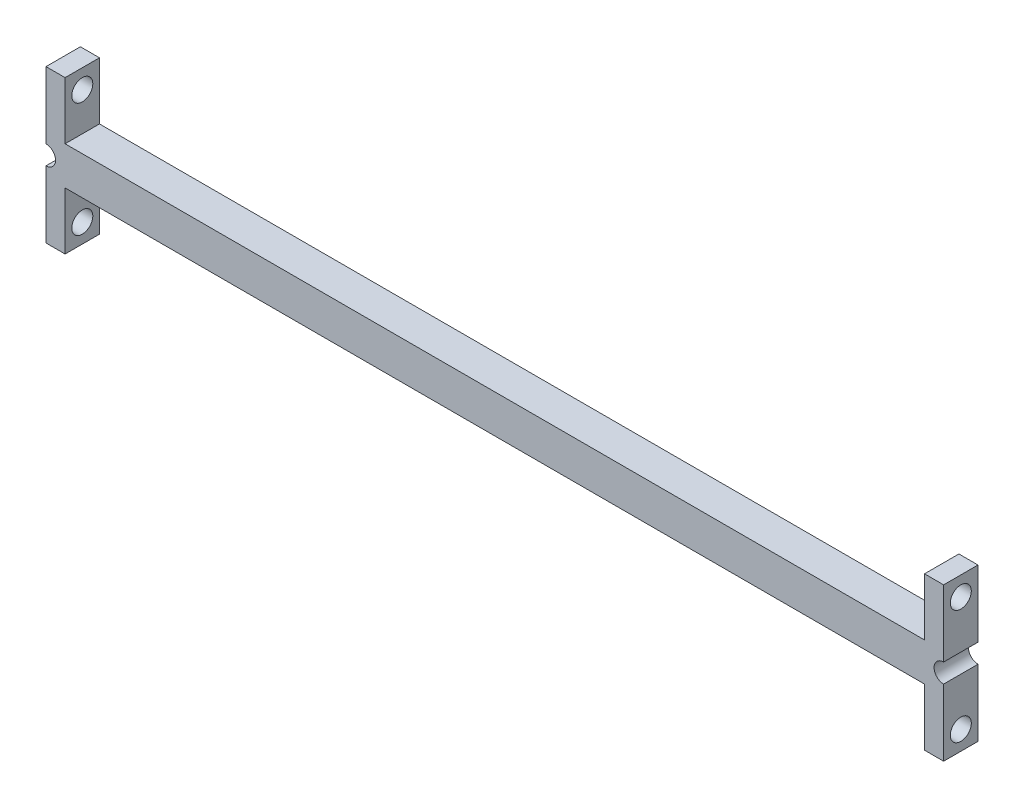
ISO-10303-21;
HEADER;
FILE_DESCRIPTION(('STEP AP214'),'2;1');
FILE_NAME('part.step','',(''),(''),'','','');
FILE_SCHEMA(('AUTOMOTIVE_DESIGN { 1 0 10303 214 1 1 1 1 }'));
ENDSEC;
DATA;
#1=APPLICATION_CONTEXT('core data for automotive mechanical design processes');
#2=APPLICATION_PROTOCOL_DEFINITION('international standard','automotive_design',2000,#1);
#3=PRODUCT_CONTEXT('',#1,'mechanical');
#4=PRODUCT('Part','Part','',(#3));
#5=PRODUCT_RELATED_PRODUCT_CATEGORY('part','',(#4));
#6=PRODUCT_DEFINITION_FORMATION('','',#4);
#7=PRODUCT_DEFINITION_CONTEXT('part definition',#1,'design');
#8=PRODUCT_DEFINITION('design','',#6,#7);
#9=PRODUCT_DEFINITION_SHAPE('','',#8);
#10=(LENGTH_UNIT() NAMED_UNIT(*) SI_UNIT(.MILLI.,.METRE.));
#11=(NAMED_UNIT(*) PLANE_ANGLE_UNIT() SI_UNIT($,.RADIAN.));
#12=(NAMED_UNIT(*) SI_UNIT($,.STERADIAN.) SOLID_ANGLE_UNIT());
#13=UNCERTAINTY_MEASURE_WITH_UNIT(LENGTH_MEASURE(1.E-05),#10,'distance_accuracy_value','');
#14=(GEOMETRIC_REPRESENTATION_CONTEXT(3) GLOBAL_UNCERTAINTY_ASSIGNED_CONTEXT((#13)) GLOBAL_UNIT_ASSIGNED_CONTEXT((#10,
#11,#12)) REPRESENTATION_CONTEXT('',''));
#15=CARTESIAN_POINT('',(0.,0.,0.));
#16=DIRECTION('',(0.,0.,1.));
#17=DIRECTION('',(1.,0.,0.));
#18=AXIS2_PLACEMENT_3D('',#15,#16,#17);
#19=CARTESIAN_POINT('',(0.,0.,9.));
#20=DIRECTION('',(1.,0.,0.));
#21=DIRECTION('',(0.,1.,0.));
#22=AXIS2_PLACEMENT_3D('',#19,#20,#21);
#23=PLANE('',#22);
#24=CARTESIAN_POINT('',(0.,10.,4.5));
#25=DIRECTION('',(-1.,0.,0.));
#26=DIRECTION('',(0.,-1.,0.));
#27=AXIS2_PLACEMENT_3D('',#24,#25,#26);
#28=CIRCLE('',#27,2.75);
#29=CARTESIAN_POINT('',(0.,7.25,4.5));
#30=VERTEX_POINT('',#29);
#31=EDGE_CURVE('E205',#30,#30,#28,.T.);
#32=ORIENTED_EDGE('',*,*,#31,.F.);
#33=EDGE_LOOP('',(#32));
#34=FACE_BOUND('',#33,.T.);
#35=DIRECTION('',(0.,-1.,0.));
#36=VECTOR('',#35,1.);
#37=CARTESIAN_POINT('',(0.,0.,0.));
#38=LINE('',#37,#36);
#39=CARTESIAN_POINT('',(0.,15.,0.));
#40=VERTEX_POINT('',#39);
#41=CARTESIAN_POINT('',(0.,-2.5,0.));
#42=VERTEX_POINT('',#41);
#43=EDGE_CURVE('E162',#40,#42,#38,.T.);
#44=ORIENTED_EDGE('',*,*,#43,.T.);
#45=DIRECTION('',(0.,0.,1.));
#46=VECTOR('',#45,1.);
#47=CARTESIAN_POINT('',(0.,-2.5,-23.));
#48=LINE('',#47,#46);
#49=CARTESIAN_POINT('',(0.,-2.5,9.));
#50=VERTEX_POINT('',#49);
#51=EDGE_CURVE('E59',#42,#50,#48,.T.);
#52=ORIENTED_EDGE('',*,*,#51,.T.);
#53=DIRECTION('',(0.,-1.,0.));
#54=VECTOR('',#53,1.);
#55=CARTESIAN_POINT('',(0.,0.,9.));
#56=LINE('',#55,#54);
#57=CARTESIAN_POINT('',(0.,15.,9.));
#58=VERTEX_POINT('',#57);
#59=EDGE_CURVE('E160',#58,#50,#56,.T.);
#60=ORIENTED_EDGE('',*,*,#59,.F.);
#61=DIRECTION('',(0.,0.,1.));
#62=VECTOR('',#61,1.);
#63=CARTESIAN_POINT('',(0.,15.,0.));
#64=LINE('',#63,#62);
#65=EDGE_CURVE('E242',#40,#58,#64,.T.);
#66=ORIENTED_EDGE('',*,*,#65,.F.);
#67=EDGE_LOOP('',(#44,#52,#60,#66));
#68=FACE_BOUND('',#67,.T.);
#69=ADVANCED_FACE('F35',(#34,#68),#23,.F.);
#70=CARTESIAN_POINT('',(235.,0.,9.));
#71=DIRECTION('',(-1.,0.,0.));
#72=DIRECTION('',(0.,0.,1.));
#73=AXIS2_PLACEMENT_3D('',#70,#71,#72);
#74=PLANE('',#73);
#75=CARTESIAN_POINT('',(235.,-20.,4.5));
#76=DIRECTION('',(-1.,0.,0.));
#77=DIRECTION('',(0.,-1.,0.));
#78=AXIS2_PLACEMENT_3D('',#75,#76,#77);
#79=CIRCLE('',#78,2.75);
#80=CARTESIAN_POINT('',(235.,-22.75,4.5));
#81=VERTEX_POINT('',#80);
#82=EDGE_CURVE('E215',#81,#81,#79,.T.);
#83=ORIENTED_EDGE('',*,*,#82,.T.);
#84=EDGE_LOOP('',(#83));
#85=FACE_BOUND('',#84,.T.);
#86=DIRECTION('',(0.,1.,0.));
#87=VECTOR('',#86,1.);
#88=CARTESIAN_POINT('',(235.,0.,0.));
#89=LINE('',#88,#87);
#90=CARTESIAN_POINT('',(235.,-25.,0.));
#91=VERTEX_POINT('',#90);
#92=CARTESIAN_POINT('',(235.,-7.49999999999999,0.));
#93=VERTEX_POINT('',#92);
#94=EDGE_CURVE('E191',#91,#93,#89,.T.);
#95=ORIENTED_EDGE('',*,*,#94,.T.);
#96=DIRECTION('',(0.,0.,1.));
#97=VECTOR('',#96,1.);
#98=CARTESIAN_POINT('',(235.,-7.49999999999999,-23.));
#99=LINE('',#98,#97);
#100=CARTESIAN_POINT('',(235.,-7.49999999999999,9.));
#101=VERTEX_POINT('',#100);
#102=EDGE_CURVE('E52',#93,#101,#99,.T.);
#103=ORIENTED_EDGE('',*,*,#102,.T.);
#104=DIRECTION('',(0.,1.,0.));
#105=VECTOR('',#104,1.);
#106=CARTESIAN_POINT('',(235.,0.,9.));
#107=LINE('',#106,#105);
#108=CARTESIAN_POINT('',(235.,-25.,9.));
#109=VERTEX_POINT('',#108);
#110=EDGE_CURVE('E180',#109,#101,#107,.T.);
#111=ORIENTED_EDGE('',*,*,#110,.F.);
#112=DIRECTION('',(0.,0.,1.));
#113=VECTOR('',#112,1.);
#114=CARTESIAN_POINT('',(235.,-25.,0.));
#115=LINE('',#114,#113);
#116=EDGE_CURVE('E282',#91,#109,#115,.T.);
#117=ORIENTED_EDGE('',*,*,#116,.F.);
#118=EDGE_LOOP('',(#95,#103,#111,#117));
#119=FACE_BOUND('',#118,.T.);
#120=ADVANCED_FACE('F324',(#85,#119),#74,.F.);
#121=CARTESIAN_POINT('',(0.,-20.,4.5));
#122=DIRECTION('',(-1.,0.,0.));
#123=DIRECTION('',(0.,-1.,0.));
#124=AXIS2_PLACEMENT_3D('',#121,#122,#123);
#125=CIRCLE('',#124,2.75);
#126=CARTESIAN_POINT('',(0.,-22.75,4.5));
#127=VERTEX_POINT('',#126);
#128=EDGE_CURVE('E210',#127,#127,#125,.T.);
#129=ORIENTED_EDGE('',*,*,#128,.F.);
#130=EDGE_LOOP('',(#129));
#131=FACE_BOUND('',#130,.T.);
#132=CARTESIAN_POINT('',(0.,-7.5,9.));
#133=VERTEX_POINT('',#132);
#134=CARTESIAN_POINT('',(0.,-25.,9.));
#135=VERTEX_POINT('',#134);
#136=EDGE_CURVE('E171',#133,#135,#56,.T.);
#137=ORIENTED_EDGE('',*,*,#136,.F.);
#138=DIRECTION('',(0.,0.,1.));
#139=VECTOR('',#138,1.);
#140=CARTESIAN_POINT('',(0.,-7.5,-23.));
#141=LINE('',#140,#139);
#142=CARTESIAN_POINT('',(0.,-7.5,0.));
#143=VERTEX_POINT('',#142);
#144=EDGE_CURVE('E150',#133,#143,#141,.F.);
#145=ORIENTED_EDGE('',*,*,#144,.T.);
#146=CARTESIAN_POINT('',(0.,-25.,0.));
#147=VERTEX_POINT('',#146);
#148=EDGE_CURVE('E188',#143,#147,#38,.T.);
#149=ORIENTED_EDGE('',*,*,#148,.T.);
#150=DIRECTION('',(0.,0.,1.));
#151=VECTOR('',#150,1.);
#152=CARTESIAN_POINT('',(0.,-25.,0.));
#153=LINE('',#152,#151);
#154=EDGE_CURVE('E235',#147,#135,#153,.T.);
#155=ORIENTED_EDGE('',*,*,#154,.T.);
#156=EDGE_LOOP('',(#137,#145,#149,#155));
#157=FACE_BOUND('',#156,.T.);
#158=ADVANCED_FACE('F37',(#131,#157),#23,.F.);
#159=CARTESIAN_POINT('',(0.,-10.,9.));
#160=DIRECTION('',(0.,1.,0.));
#161=DIRECTION('',(-1.,0.,0.));
#162=AXIS2_PLACEMENT_3D('',#159,#160,#161);
#163=PLANE('',#162);
#164=DIRECTION('',(1.,0.,0.));
#165=VECTOR('',#164,1.);
#166=CARTESIAN_POINT('',(0.,-10.,9.));
#167=LINE('',#166,#165);
#168=CARTESIAN_POINT('',(5.,-10.,9.));
#169=VERTEX_POINT('',#168);
#170=CARTESIAN_POINT('',(230.,-10.,9.));
#171=VERTEX_POINT('',#170);
#172=EDGE_CURVE('E170',#169,#171,#167,.T.);
#173=ORIENTED_EDGE('',*,*,#172,.F.);
#174=DIRECTION('',(0.,0.,-1.));
#175=VECTOR('',#174,1.);
#176=CARTESIAN_POINT('',(5.,-10.,9.));
#177=LINE('',#176,#175);
#178=CARTESIAN_POINT('',(5.,-10.,0.));
#179=VERTEX_POINT('',#178);
#180=EDGE_CURVE('E254',#169,#179,#177,.T.);
#181=ORIENTED_EDGE('',*,*,#180,.T.);
#182=DIRECTION('',(1.,0.,0.));
#183=VECTOR('',#182,1.);
#184=CARTESIAN_POINT('',(0.,-10.,0.));
#185=LINE('',#184,#183);
#186=CARTESIAN_POINT('',(230.,-10.,0.));
#187=VERTEX_POINT('',#186);
#188=EDGE_CURVE('E187',#179,#187,#185,.T.);
#189=ORIENTED_EDGE('',*,*,#188,.T.);
#190=DIRECTION('',(0.,0.,1.));
#191=VECTOR('',#190,1.);
#192=CARTESIAN_POINT('',(230.,-10.,9.));
#193=LINE('',#192,#191);
#194=EDGE_CURVE('E177',#187,#171,#193,.T.);
#195=ORIENTED_EDGE('',*,*,#194,.T.);
#196=EDGE_LOOP('',(#173,#181,#189,#195));
#197=FACE_BOUND('',#196,.T.);
#198=ADVANCED_FACE('F312',(#197),#163,.F.);
#199=CARTESIAN_POINT('',(235.,10.,4.5));
#200=DIRECTION('',(-1.,0.,0.));
#201=DIRECTION('',(0.,-1.,0.));
#202=AXIS2_PLACEMENT_3D('',#199,#200,#201);
#203=CIRCLE('',#202,2.75);
#204=CARTESIAN_POINT('',(235.,7.25000000000003,4.5));
#205=VERTEX_POINT('',#204);
#206=EDGE_CURVE('E199',#205,#205,#203,.T.);
#207=ORIENTED_EDGE('',*,*,#206,.T.);
#208=EDGE_LOOP('',(#207));
#209=FACE_BOUND('',#208,.T.);
#210=CARTESIAN_POINT('',(235.,-2.5,9.));
#211=VERTEX_POINT('',#210);
#212=CARTESIAN_POINT('',(235.,15.,9.));
#213=VERTEX_POINT('',#212);
#214=EDGE_CURVE('E173',#211,#213,#107,.T.);
#215=ORIENTED_EDGE('',*,*,#214,.F.);
#216=DIRECTION('',(0.,0.,1.));
#217=VECTOR('',#216,1.);
#218=CARTESIAN_POINT('',(235.,-2.5,-23.));
#219=LINE('',#218,#217);
#220=CARTESIAN_POINT('',(235.,-2.5,0.));
#221=VERTEX_POINT('',#220);
#222=EDGE_CURVE('E163',#211,#221,#219,.F.);
#223=ORIENTED_EDGE('',*,*,#222,.T.);
#224=CARTESIAN_POINT('',(235.,15.,0.));
#225=VERTEX_POINT('',#224);
#226=EDGE_CURVE('E190',#221,#225,#89,.T.);
#227=ORIENTED_EDGE('',*,*,#226,.T.);
#228=DIRECTION('',(0.,0.,1.));
#229=VECTOR('',#228,1.);
#230=CARTESIAN_POINT('',(235.,15.,0.));
#231=LINE('',#230,#229);
#232=EDGE_CURVE('E279',#225,#213,#231,.T.);
#233=ORIENTED_EDGE('',*,*,#232,.T.);
#234=EDGE_LOOP('',(#215,#223,#227,#233));
#235=FACE_BOUND('',#234,.T.);
#236=ADVANCED_FACE('F328',(#209,#235),#74,.F.);
#237=CARTESIAN_POINT('',(0.,0.,9.));
#238=DIRECTION('',(0.,-1.,0.));
#239=DIRECTION('',(0.,0.,-1.));
#240=AXIS2_PLACEMENT_3D('',#237,#238,#239);
#241=PLANE('',#240);
#242=DIRECTION('',(-1.,0.,0.));
#243=VECTOR('',#242,1.);
#244=CARTESIAN_POINT('',(0.,0.,0.));
#245=LINE('',#244,#243);
#246=CARTESIAN_POINT('',(230.,0.,0.));
#247=VERTEX_POINT('',#246);
#248=CARTESIAN_POINT('',(5.,0.,0.));
#249=VERTEX_POINT('',#248);
#250=EDGE_CURVE('E175',#247,#249,#245,.T.);
#251=ORIENTED_EDGE('',*,*,#250,.T.);
#252=DIRECTION('',(0.,0.,1.));
#253=VECTOR('',#252,1.);
#254=CARTESIAN_POINT('',(5.,0.,9.));
#255=LINE('',#254,#253);
#256=CARTESIAN_POINT('',(5.,0.,9.));
#257=VERTEX_POINT('',#256);
#258=EDGE_CURVE('E244',#249,#257,#255,.T.);
#259=ORIENTED_EDGE('',*,*,#258,.T.);
#260=DIRECTION('',(-1.,0.,0.));
#261=VECTOR('',#260,1.);
#262=CARTESIAN_POINT('',(0.,0.,9.));
#263=LINE('',#262,#261);
#264=CARTESIAN_POINT('',(230.,0.,9.));
#265=VERTEX_POINT('',#264);
#266=EDGE_CURVE('E183',#265,#257,#263,.T.);
#267=ORIENTED_EDGE('',*,*,#266,.F.);
#268=DIRECTION('',(0.,0.,-1.));
#269=VECTOR('',#268,1.);
#270=CARTESIAN_POINT('',(230.,0.,9.));
#271=LINE('',#270,#269);
#272=EDGE_CURVE('E278',#265,#247,#271,.T.);
#273=ORIENTED_EDGE('',*,*,#272,.T.);
#274=EDGE_LOOP('',(#251,#259,#267,#273));
#275=FACE_BOUND('',#274,.T.);
#276=ADVANCED_FACE('F337',(#275),#241,.F.);
#277=CARTESIAN_POINT('',(0.,0.,9.));
#278=DIRECTION('',(0.,0.,1.));
#279=DIRECTION('',(1.,0.,0.));
#280=AXIS2_PLACEMENT_3D('',#277,#278,#279);
#281=PLANE('',#280);
#282=CARTESIAN_POINT('',(235.,-5.,9.));
#283=DIRECTION('',(0.,0.,1.));
#284=DIRECTION('',(1.,0.,0.));
#285=AXIS2_PLACEMENT_3D('',#282,#283,#284);
#286=CIRCLE('',#285,2.5);
#287=EDGE_CURVE('E154',#211,#101,#286,.T.);
#288=ORIENTED_EDGE('',*,*,#287,.F.);
#289=ORIENTED_EDGE('',*,*,#214,.T.);
#290=DIRECTION('',(-1.,0.,0.));
#291=VECTOR('',#290,1.);
#292=CARTESIAN_POINT('',(230.,15.,9.));
#293=LINE('',#292,#291);
#294=CARTESIAN_POINT('',(230.,15.,9.));
#295=VERTEX_POINT('',#294);
#296=EDGE_CURVE('E273',#213,#295,#293,.T.);
#297=ORIENTED_EDGE('',*,*,#296,.T.);
#298=DIRECTION('',(0.,-1.,0.));
#299=VECTOR('',#298,1.);
#300=CARTESIAN_POINT('',(230.,15.,9.));
#301=LINE('',#300,#299);
#302=EDGE_CURVE('E268',#295,#265,#301,.T.);
#303=ORIENTED_EDGE('',*,*,#302,.T.);
#304=ORIENTED_EDGE('',*,*,#266,.T.);
#305=DIRECTION('',(0.,1.,0.));
#306=VECTOR('',#305,1.);
#307=CARTESIAN_POINT('',(5.,15.,9.));
#308=LINE('',#307,#306);
#309=CARTESIAN_POINT('',(5.,15.,9.));
#310=VERTEX_POINT('',#309);
#311=EDGE_CURVE('E238',#257,#310,#308,.T.);
#312=ORIENTED_EDGE('',*,*,#311,.T.);
#313=DIRECTION('',(-1.,0.,0.));
#314=VECTOR('',#313,1.);
#315=CARTESIAN_POINT('',(0.,15.,9.));
#316=LINE('',#315,#314);
#317=EDGE_CURVE('E169',#310,#58,#316,.T.);
#318=ORIENTED_EDGE('',*,*,#317,.T.);
#319=ORIENTED_EDGE('',*,*,#59,.T.);
#320=CARTESIAN_POINT('',(0.,-5.,9.));
#321=DIRECTION('',(0.,0.,1.));
#322=DIRECTION('',(1.,0.,0.));
#323=AXIS2_PLACEMENT_3D('',#320,#321,#322);
#324=CIRCLE('',#323,2.5);
#325=EDGE_CURVE('E147',#133,#50,#324,.T.);
#326=ORIENTED_EDGE('',*,*,#325,.F.);
#327=ORIENTED_EDGE('',*,*,#136,.T.);
#328=DIRECTION('',(1.,0.,0.));
#329=VECTOR('',#328,1.);
#330=CARTESIAN_POINT('',(0.,-25.,9.));
#331=LINE('',#330,#329);
#332=CARTESIAN_POINT('',(5.00000000000001,-25.,9.));
#333=VERTEX_POINT('',#332);
#334=EDGE_CURVE('E225',#135,#333,#331,.T.);
#335=ORIENTED_EDGE('',*,*,#334,.T.);
#336=EDGE_CURVE('E239',#333,#169,#308,.T.);
#337=ORIENTED_EDGE('',*,*,#336,.T.);
#338=ORIENTED_EDGE('',*,*,#172,.T.);
#339=CARTESIAN_POINT('',(230.,-25.,9.));
#340=VERTEX_POINT('',#339);
#341=EDGE_CURVE('E257',#171,#340,#301,.T.);
#342=ORIENTED_EDGE('',*,*,#341,.T.);
#343=DIRECTION('',(1.,0.,0.));
#344=VECTOR('',#343,1.);
#345=CARTESIAN_POINT('',(230.,-25.,9.));
#346=LINE('',#345,#344);
#347=EDGE_CURVE('E270',#340,#109,#346,.T.);
#348=ORIENTED_EDGE('',*,*,#347,.T.);
#349=ORIENTED_EDGE('',*,*,#110,.T.);
#350=EDGE_LOOP('',(#288,#289,#297,#303,#304,#312,#318,#319,#326,#327,#335,#337,#338,#342,#348,#349));
#351=FACE_BOUND('',#350,.T.);
#352=ADVANCED_FACE('F167',(#351),#281,.T.);
#353=CARTESIAN_POINT('',(0.,0.,0.));
#354=DIRECTION('',(0.,0.,1.));
#355=DIRECTION('',(1.,0.,0.));
#356=AXIS2_PLACEMENT_3D('',#353,#354,#355);
#357=PLANE('',#356);
#358=ORIENTED_EDGE('',*,*,#226,.F.);
#359=CARTESIAN_POINT('',(235.,-5.,0.));
#360=DIRECTION('',(0.,0.,1.));
#361=DIRECTION('',(1.,0.,0.));
#362=AXIS2_PLACEMENT_3D('',#359,#360,#361);
#363=CIRCLE('',#362,2.5);
#364=EDGE_CURVE('E11',#221,#93,#363,.T.);
#365=ORIENTED_EDGE('',*,*,#364,.T.);
#366=ORIENTED_EDGE('',*,*,#94,.F.);
#367=DIRECTION('',(1.,0.,0.));
#368=VECTOR('',#367,1.);
#369=CARTESIAN_POINT('',(230.,-25.,0.));
#370=LINE('',#369,#368);
#371=CARTESIAN_POINT('',(230.,-25.,0.));
#372=VERTEX_POINT('',#371);
#373=EDGE_CURVE('E260',#372,#91,#370,.T.);
#374=ORIENTED_EDGE('',*,*,#373,.F.);
#375=DIRECTION('',(0.,-1.,0.));
#376=VECTOR('',#375,1.);
#377=CARTESIAN_POINT('',(230.,15.,0.));
#378=LINE('',#377,#376);
#379=EDGE_CURVE('E261',#187,#372,#378,.T.);
#380=ORIENTED_EDGE('',*,*,#379,.F.);
#381=ORIENTED_EDGE('',*,*,#188,.F.);
#382=DIRECTION('',(0.,1.,0.));
#383=VECTOR('',#382,1.);
#384=CARTESIAN_POINT('',(5.,15.,0.));
#385=LINE('',#384,#383);
#386=CARTESIAN_POINT('',(5.00000000000001,-25.,0.));
#387=VERTEX_POINT('',#386);
#388=EDGE_CURVE('E230',#387,#179,#385,.T.);
#389=ORIENTED_EDGE('',*,*,#388,.F.);
#390=DIRECTION('',(1.,0.,0.));
#391=VECTOR('',#390,1.);
#392=CARTESIAN_POINT('',(0.,-25.,0.));
#393=LINE('',#392,#391);
#394=EDGE_CURVE('E226',#147,#387,#393,.T.);
#395=ORIENTED_EDGE('',*,*,#394,.F.);
#396=ORIENTED_EDGE('',*,*,#148,.F.);
#397=CARTESIAN_POINT('',(0.,-5.,0.));
#398=DIRECTION('',(0.,0.,1.));
#399=DIRECTION('',(1.,0.,0.));
#400=AXIS2_PLACEMENT_3D('',#397,#398,#399);
#401=CIRCLE('',#400,2.5);
#402=EDGE_CURVE('E44',#143,#42,#401,.T.);
#403=ORIENTED_EDGE('',*,*,#402,.T.);
#404=ORIENTED_EDGE('',*,*,#43,.F.);
#405=DIRECTION('',(-1.,0.,0.));
#406=VECTOR('',#405,1.);
#407=CARTESIAN_POINT('',(0.,15.,0.));
#408=LINE('',#407,#406);
#409=CARTESIAN_POINT('',(5.,15.,0.));
#410=VERTEX_POINT('',#409);
#411=EDGE_CURVE('E232',#410,#40,#408,.T.);
#412=ORIENTED_EDGE('',*,*,#411,.F.);
#413=EDGE_CURVE('E229',#249,#410,#385,.T.);
#414=ORIENTED_EDGE('',*,*,#413,.F.);
#415=ORIENTED_EDGE('',*,*,#250,.F.);
#416=CARTESIAN_POINT('',(230.,15.,0.));
#417=VERTEX_POINT('',#416);
#418=EDGE_CURVE('E258',#417,#247,#378,.T.);
#419=ORIENTED_EDGE('',*,*,#418,.F.);
#420=DIRECTION('',(-1.,0.,0.));
#421=VECTOR('',#420,1.);
#422=CARTESIAN_POINT('',(230.,15.,0.));
#423=LINE('',#422,#421);
#424=EDGE_CURVE('E264',#225,#417,#423,.T.);
#425=ORIENTED_EDGE('',*,*,#424,.F.);
#426=EDGE_LOOP('',(#358,#365,#366,#374,#380,#381,#389,#395,#396,#403,#404,#412,#414,#415,#419,#425));
#427=FACE_BOUND('',#426,.T.);
#428=ADVANCED_FACE('F305',(#427),#357,.F.);
#429=CARTESIAN_POINT('',(230.,15.,0.));
#430=DIRECTION('',(0.,1.,0.));
#431=DIRECTION('',(0.,0.,1.));
#432=AXIS2_PLACEMENT_3D('',#429,#430,#431);
#433=PLANE('',#432);
#434=ORIENTED_EDGE('',*,*,#296,.F.);
#435=ORIENTED_EDGE('',*,*,#232,.F.);
#436=ORIENTED_EDGE('',*,*,#424,.T.);
#437=DIRECTION('',(0.,0.,1.));
#438=VECTOR('',#437,1.);
#439=CARTESIAN_POINT('',(230.,15.,0.));
#440=LINE('',#439,#438);
#441=EDGE_CURVE('E276',#417,#295,#440,.T.);
#442=ORIENTED_EDGE('',*,*,#441,.T.);
#443=EDGE_LOOP('',(#434,#435,#436,#442));
#444=FACE_BOUND('',#443,.T.);
#445=ADVANCED_FACE('F333',(#444),#433,.T.);
#446=CARTESIAN_POINT('',(230.,15.,0.));
#447=DIRECTION('',(-1.,0.,0.));
#448=DIRECTION('',(0.,0.,1.));
#449=AXIS2_PLACEMENT_3D('',#446,#447,#448);
#450=PLANE('',#449);
#451=CARTESIAN_POINT('',(230.,10.,4.5));
#452=DIRECTION('',(-1.,0.,0.));
#453=DIRECTION('',(0.,0.,1.));
#454=AXIS2_PLACEMENT_3D('',#451,#452,#453);
#455=CIRCLE('',#454,2.75);
#456=CARTESIAN_POINT('',(230.,7.25000000000003,4.5));
#457=VERTEX_POINT('',#456);
#458=EDGE_CURVE('E155',#457,#457,#455,.T.);
#459=ORIENTED_EDGE('',*,*,#458,.F.);
#460=EDGE_LOOP('',(#459));
#461=FACE_BOUND('',#460,.T.);
#462=ORIENTED_EDGE('',*,*,#272,.F.);
#463=ORIENTED_EDGE('',*,*,#302,.F.);
#464=ORIENTED_EDGE('',*,*,#441,.F.);
#465=ORIENTED_EDGE('',*,*,#418,.T.);
#466=EDGE_LOOP('',(#462,#463,#464,#465));
#467=FACE_BOUND('',#466,.T.);
#468=ADVANCED_FACE('F336',(#461,#467),#450,.T.);
#469=CARTESIAN_POINT('',(230.,-20.,4.5));
#470=DIRECTION('',(-1.,0.,0.));
#471=DIRECTION('',(0.,0.,1.));
#472=AXIS2_PLACEMENT_3D('',#469,#470,#471);
#473=CIRCLE('',#472,2.75);
#474=CARTESIAN_POINT('',(230.,-22.75,4.5));
#475=VERTEX_POINT('',#474);
#476=EDGE_CURVE('E198',#475,#475,#473,.T.);
#477=ORIENTED_EDGE('',*,*,#476,.F.);
#478=EDGE_LOOP('',(#477));
#479=FACE_BOUND('',#478,.T.);
#480=ORIENTED_EDGE('',*,*,#194,.F.);
#481=ORIENTED_EDGE('',*,*,#379,.T.);
#482=DIRECTION('',(0.,0.,1.));
#483=VECTOR('',#482,1.);
#484=CARTESIAN_POINT('',(230.,-25.,0.));
#485=LINE('',#484,#483);
#486=EDGE_CURVE('E267',#372,#340,#485,.T.);
#487=ORIENTED_EDGE('',*,*,#486,.T.);
#488=ORIENTED_EDGE('',*,*,#341,.F.);
#489=EDGE_LOOP('',(#480,#481,#487,#488));
#490=FACE_BOUND('',#489,.T.);
#491=ADVANCED_FACE('F315',(#479,#490),#450,.T.);
#492=CARTESIAN_POINT('',(230.,-25.,0.));
#493=DIRECTION('',(0.,-1.,0.));
#494=DIRECTION('',(0.,0.,-1.));
#495=AXIS2_PLACEMENT_3D('',#492,#493,#494);
#496=PLANE('',#495);
#497=ORIENTED_EDGE('',*,*,#347,.F.);
#498=ORIENTED_EDGE('',*,*,#486,.F.);
#499=ORIENTED_EDGE('',*,*,#373,.T.);
#500=ORIENTED_EDGE('',*,*,#116,.T.);
#501=EDGE_LOOP('',(#497,#498,#499,#500));
#502=FACE_BOUND('',#501,.T.);
#503=ADVANCED_FACE('F320',(#502),#496,.T.);
#504=CARTESIAN_POINT('',(0.,15.,0.));
#505=DIRECTION('',(0.,1.,0.));
#506=DIRECTION('',(0.,0.,1.));
#507=AXIS2_PLACEMENT_3D('',#504,#505,#506);
#508=PLANE('',#507);
#509=ORIENTED_EDGE('',*,*,#317,.F.);
#510=DIRECTION('',(0.,0.,1.));
#511=VECTOR('',#510,1.);
#512=CARTESIAN_POINT('',(5.,15.,0.));
#513=LINE('',#512,#511);
#514=EDGE_CURVE('E245',#410,#310,#513,.T.);
#515=ORIENTED_EDGE('',*,*,#514,.F.);
#516=ORIENTED_EDGE('',*,*,#411,.T.);
#517=ORIENTED_EDGE('',*,*,#65,.T.);
#518=EDGE_LOOP('',(#509,#515,#516,#517));
#519=FACE_BOUND('',#518,.T.);
#520=ADVANCED_FACE('F344',(#519),#508,.T.);
#521=CARTESIAN_POINT('',(5.,15.,0.));
#522=DIRECTION('',(1.,0.,0.));
#523=DIRECTION('',(0.,1.,0.));
#524=AXIS2_PLACEMENT_3D('',#521,#522,#523);
#525=PLANE('',#524);
#526=CARTESIAN_POINT('',(5.,10.,4.5));
#527=DIRECTION('',(1.,0.,0.));
#528=DIRECTION('',(0.,1.,0.));
#529=AXIS2_PLACEMENT_3D('',#526,#527,#528);
#530=CIRCLE('',#529,2.75);
#531=CARTESIAN_POINT('',(5.00000000000003,7.25,4.5));
#532=VERTEX_POINT('',#531);
#533=EDGE_CURVE('E39',#532,#532,#530,.T.);
#534=ORIENTED_EDGE('',*,*,#533,.F.);
#535=EDGE_LOOP('',(#534));
#536=FACE_BOUND('',#535,.T.);
#537=ORIENTED_EDGE('',*,*,#258,.F.);
#538=ORIENTED_EDGE('',*,*,#413,.T.);
#539=ORIENTED_EDGE('',*,*,#514,.T.);
#540=ORIENTED_EDGE('',*,*,#311,.F.);
#541=EDGE_LOOP('',(#537,#538,#539,#540));
#542=FACE_BOUND('',#541,.T.);
#543=ADVANCED_FACE('F340',(#536,#542),#525,.T.);
#544=CARTESIAN_POINT('',(5.,-20.,4.5));
#545=DIRECTION('',(1.,0.,0.));
#546=DIRECTION('',(0.,1.,0.));
#547=AXIS2_PLACEMENT_3D('',#544,#545,#546);
#548=CIRCLE('',#547,2.75);
#549=CARTESIAN_POINT('',(5.00000000000003,-22.75,4.5));
#550=VERTEX_POINT('',#549);
#551=EDGE_CURVE('E196',#550,#550,#548,.T.);
#552=ORIENTED_EDGE('',*,*,#551,.F.);
#553=EDGE_LOOP('',(#552));
#554=FACE_BOUND('',#553,.T.);
#555=ORIENTED_EDGE('',*,*,#180,.F.);
#556=ORIENTED_EDGE('',*,*,#336,.F.);
#557=DIRECTION('',(0.,0.,1.));
#558=VECTOR('',#557,1.);
#559=CARTESIAN_POINT('',(5.00000000000001,-25.,0.));
#560=LINE('',#559,#558);
#561=EDGE_CURVE('E248',#387,#333,#560,.T.);
#562=ORIENTED_EDGE('',*,*,#561,.F.);
#563=ORIENTED_EDGE('',*,*,#388,.T.);
#564=EDGE_LOOP('',(#555,#556,#562,#563));
#565=FACE_BOUND('',#564,.T.);
#566=ADVANCED_FACE('F310',(#554,#565),#525,.T.);
#567=CARTESIAN_POINT('',(0.,-25.,0.));
#568=DIRECTION('',(0.,-1.,0.));
#569=DIRECTION('',(0.,0.,-1.));
#570=AXIS2_PLACEMENT_3D('',#567,#568,#569);
#571=PLANE('',#570);
#572=ORIENTED_EDGE('',*,*,#334,.F.);
#573=ORIENTED_EDGE('',*,*,#154,.F.);
#574=ORIENTED_EDGE('',*,*,#394,.T.);
#575=ORIENTED_EDGE('',*,*,#561,.T.);
#576=EDGE_LOOP('',(#572,#573,#574,#575));
#577=FACE_BOUND('',#576,.T.);
#578=ADVANCED_FACE('F302',(#577),#571,.T.);
#579=CARTESIAN_POINT('',(0.,-5.,-23.));
#580=DIRECTION('',(0.,0.,1.));
#581=DIRECTION('',(1.,0.,0.));
#582=AXIS2_PLACEMENT_3D('',#579,#580,#581);
#583=CYLINDRICAL_SURFACE('',#582,2.5);
#584=ORIENTED_EDGE('',*,*,#402,.F.);
#585=ORIENTED_EDGE('',*,*,#144,.F.);
#586=ORIENTED_EDGE('',*,*,#325,.T.);
#587=ORIENTED_EDGE('',*,*,#51,.F.);
#588=EDGE_LOOP('',(#584,#585,#586,#587));
#589=FACE_BOUND('',#588,.T.);
#590=ADVANCED_FACE('F148',(#589),#583,.F.);
#591=CARTESIAN_POINT('',(235.,-5.,-23.));
#592=DIRECTION('',(0.,0.,1.));
#593=DIRECTION('',(1.,0.,0.));
#594=AXIS2_PLACEMENT_3D('',#591,#592,#593);
#595=CYLINDRICAL_SURFACE('',#594,2.5);
#596=ORIENTED_EDGE('',*,*,#364,.F.);
#597=ORIENTED_EDGE('',*,*,#222,.F.);
#598=ORIENTED_EDGE('',*,*,#287,.T.);
#599=ORIENTED_EDGE('',*,*,#102,.F.);
#600=EDGE_LOOP('',(#596,#597,#598,#599));
#601=FACE_BOUND('',#600,.T.);
#602=ADVANCED_FACE('F326',(#601),#595,.F.);
#603=CARTESIAN_POINT('',(235.,-20.,4.5));
#604=DIRECTION('',(-1.,0.,0.));
#605=DIRECTION('',(0.,-1.,0.));
#606=AXIS2_PLACEMENT_3D('',#603,#604,#605);
#607=CYLINDRICAL_SURFACE('',#606,2.75);
#608=CARTESIAN_POINT('',(5.00000000000003,-22.75,4.5));
#609=CARTESIAN_POINT('',(4.9479166666667,-22.75,4.5));
#610=CARTESIAN_POINT('',(4.89583333333337,-22.75,4.5));
#611=CARTESIAN_POINT('',(4.7916666666667,-22.75,4.5));
#612=CARTESIAN_POINT('',(4.73958333333337,-22.75,4.5));
#613=CARTESIAN_POINT('',(4.63541666666671,-22.75,4.5));
#614=CARTESIAN_POINT('',(4.58333333333337,-22.75,4.5));
#615=CARTESIAN_POINT('',(4.47916666666671,-22.75,4.5));
#616=CARTESIAN_POINT('',(4.42708333333338,-22.75,4.5));
#617=CARTESIAN_POINT('',(4.3229166666667,-22.75,4.5));
#618=CARTESIAN_POINT('',(4.27083333333336,-22.75,4.5));
#619=CARTESIAN_POINT('',(4.16666666666669,-22.75,4.5));
#620=CARTESIAN_POINT('',(4.11458333333336,-22.75,4.5));
#621=CARTESIAN_POINT('',(4.01041666666669,-22.75,4.5));
#622=CARTESIAN_POINT('',(3.95833333333336,-22.75,4.5));
#623=CARTESIAN_POINT('',(3.8541666666667,-22.75,4.5));
#624=CARTESIAN_POINT('',(3.80208333333336,-22.75,4.5));
#625=CARTESIAN_POINT('',(3.6979166666667,-22.75,4.5));
#626=CARTESIAN_POINT('',(3.64583333333337,-22.75,4.5));
#627=CARTESIAN_POINT('',(3.5416666666667,-22.75,4.5));
#628=CARTESIAN_POINT('',(3.48958333333337,-22.75,4.5));
#629=CARTESIAN_POINT('',(3.38541666666671,-22.75,4.5));
#630=CARTESIAN_POINT('',(3.33333333333337,-22.75,4.5));
#631=CARTESIAN_POINT('',(3.2291666666667,-22.75,4.5));
#632=CARTESIAN_POINT('',(3.17708333333336,-22.75,4.5));
#633=CARTESIAN_POINT('',(3.07291666666668,-22.75,4.5));
#634=CARTESIAN_POINT('',(3.02083333333335,-22.75,4.5));
#635=CARTESIAN_POINT('',(2.91666666666669,-22.75,4.5));
#636=CARTESIAN_POINT('',(2.86458333333336,-22.75,4.5));
#637=CARTESIAN_POINT('',(2.76041666666669,-22.75,4.5));
#638=CARTESIAN_POINT('',(2.70833333333336,-22.75,4.5));
#639=CARTESIAN_POINT('',(2.60416666666669,-22.75,4.5));
#640=CARTESIAN_POINT('',(2.55208333333336,-22.75,4.5));
#641=CARTESIAN_POINT('',(2.4479166666667,-22.75,4.5));
#642=CARTESIAN_POINT('',(2.39583333333337,-22.75,4.5));
#643=CARTESIAN_POINT('',(2.2916666666667,-22.75,4.5));
#644=CARTESIAN_POINT('',(2.23958333333337,-22.75,4.5));
#645=CARTESIAN_POINT('',(2.1354166666667,-22.75,4.5));
#646=CARTESIAN_POINT('',(2.08333333333337,-22.75,4.5));
#647=CARTESIAN_POINT('',(1.97916666666671,-22.75,4.5));
#648=CARTESIAN_POINT('',(1.92708333333338,-22.75,4.5));
#649=CARTESIAN_POINT('',(1.8229166666667,-22.75,4.5));
#650=CARTESIAN_POINT('',(1.77083333333336,-22.75,4.5));
#651=CARTESIAN_POINT('',(1.66666666666669,-22.75,4.5));
#652=CARTESIAN_POINT('',(1.61458333333335,-22.75,4.5));
#653=CARTESIAN_POINT('',(1.51041666666669,-22.75,4.5));
#654=CARTESIAN_POINT('',(1.45833333333336,-22.75,4.5));
#655=CARTESIAN_POINT('',(1.35416666666669,-22.75,4.5));
#656=CARTESIAN_POINT('',(1.30208333333336,-22.75,4.5));
#657=CARTESIAN_POINT('',(1.1979166666667,-22.75,4.5));
#658=CARTESIAN_POINT('',(1.14583333333336,-22.75,4.5));
#659=CARTESIAN_POINT('',(1.0416666666667,-22.75,4.5));
#660=CARTESIAN_POINT('',(0.989583333333368,-22.75,4.5));
#661=CARTESIAN_POINT('',(0.885416666666703,-22.75,4.5));
#662=CARTESIAN_POINT('',(0.833333333333371,-22.75,4.5));
#663=CARTESIAN_POINT('',(0.729166666666697,-22.75,4.5));
#664=CARTESIAN_POINT('',(0.677083333333356,-22.75,4.5));
#665=CARTESIAN_POINT('',(0.572916666666682,-22.75,4.5));
#666=CARTESIAN_POINT('',(0.52083333333335,-22.75,4.5));
#667=CARTESIAN_POINT('',(0.416666666666686,-22.75,4.5));
#668=CARTESIAN_POINT('',(0.364583333333353,-22.75,4.5));
#669=CARTESIAN_POINT('',(0.260416666666689,-22.75,4.5));
#670=CARTESIAN_POINT('',(0.208333333333357,-22.75,4.5));
#671=CARTESIAN_POINT('',(0.104166666666692,-22.75,4.5));
#672=CARTESIAN_POINT('',(0.05208333333336,-22.75,4.5));
#673=CARTESIAN_POINT('',(0.,-22.75,4.5));
#674=B_SPLINE_CURVE_WITH_KNOTS('',3,(#608,#609,#610,#611,#612,#613,#614,#615,#616,#617,#618,
#619,#620,#621,#622,#623,#624,#625,#626,#627,#628,#629,#630,#631,#632,#633,#634,#635,#636,#637,
#638,#639,#640,#641,#642,#643,#644,#645,#646,#647,#648,#649,#650,#651,#652,#653,#654,#655,#656,
#657,#658,#659,#660,#661,#662,#663,#664,#665,#666,#667,#668,#669,#670,#671,#672,#673),
.UNSPECIFIED.,.F.,.F.,(4,2,2,2,2,2,2,2,2,2,2,2,2,2,2,2,2,2,2,2,2,2,2,2,2,2,2,2,2,2,2,2,4),(0.,
0.156249999999997,0.312499999999993,0.46874999999999,0.624999999999987,0.781250000000011,
0.937500000000008,1.09375,1.25,1.40625,1.56249999999999,1.71874999999999,1.87500000000002,
2.03125000000001,2.18750000000001,2.34375000000001,2.5,2.65625,2.8125,2.96874999999999,
3.12499999999999,3.28125000000001,3.43750000000001,3.59375000000001,3.75,3.90625,4.0625,
4.21874999999999,4.37500000000002,4.53125000000001,4.68750000000001,4.84375000000001,5.),.UNSPECIFIED.);
#675=EDGE_CURVE('BSEAM370',#550,#127,#674,.T.);
#676=ORIENTED_EDGE('',*,*,#551,.T.);
#677=ORIENTED_EDGE('',*,*,#128,.T.);
#678=ORIENTED_EDGE('',*,*,#675,.T.);
#679=ORIENTED_EDGE('',*,*,#675,.F.);
#680=EDGE_LOOP('',(#676,#678,#677,#679));
#681=FACE_BOUND('',#680,.T.);
#682=ADVANCED_FACE('F370',(#681),#607,.F.);
#683=CARTESIAN_POINT('',(235.,10.,4.5));
#684=DIRECTION('',(-1.,0.,0.));
#685=DIRECTION('',(0.,-1.,0.));
#686=AXIS2_PLACEMENT_3D('',#683,#684,#685);
#687=CYLINDRICAL_SURFACE('',#686,2.75);
#688=CARTESIAN_POINT('',(5.00000000000003,7.25,4.5));
#689=CARTESIAN_POINT('',(4.9479166666667,7.25,4.5));
#690=CARTESIAN_POINT('',(4.89583333333337,7.25,4.5));
#691=CARTESIAN_POINT('',(4.7916666666667,7.25,4.5));
#692=CARTESIAN_POINT('',(4.73958333333337,7.25,4.5));
#693=CARTESIAN_POINT('',(4.6354166666667,7.25,4.5));
#694=CARTESIAN_POINT('',(4.58333333333336,7.25,4.5));
#695=CARTESIAN_POINT('',(4.47916666666668,7.25,4.5));
#696=CARTESIAN_POINT('',(4.42708333333335,7.25,4.5));
#697=CARTESIAN_POINT('',(4.32291666666669,7.25,4.5));
#698=CARTESIAN_POINT('',(4.27083333333335,7.25,4.5));
#699=CARTESIAN_POINT('',(4.16666666666669,7.25,4.5));
#700=CARTESIAN_POINT('',(4.11458333333336,7.25,4.5));
#701=CARTESIAN_POINT('',(4.01041666666669,7.25,4.5));
#702=CARTESIAN_POINT('',(3.95833333333336,7.25,4.5));
#703=CARTESIAN_POINT('',(3.85416666666669,7.25,4.5));
#704=CARTESIAN_POINT('',(3.80208333333334,7.25,4.5));
#705=CARTESIAN_POINT('',(3.69791666666667,7.25,4.5));
#706=CARTESIAN_POINT('',(3.64583333333334,7.25,4.5));
#707=CARTESIAN_POINT('',(3.54166666666667,7.25,4.5));
#708=CARTESIAN_POINT('',(3.48958333333334,7.25,4.5));
#709=CARTESIAN_POINT('',(3.38541666666668,7.25,4.5));
#710=CARTESIAN_POINT('',(3.33333333333335,7.25,4.5));
#711=CARTESIAN_POINT('',(3.22916666666668,7.25,4.5));
#712=CARTESIAN_POINT('',(3.17708333333335,7.25,4.5));
#713=CARTESIAN_POINT('',(3.07291666666668,7.25,4.5));
#714=CARTESIAN_POINT('',(3.02083333333335,7.25,4.5));
#715=CARTESIAN_POINT('',(2.91666666666668,7.25,4.5));
#716=CARTESIAN_POINT('',(2.86458333333334,7.25,4.5));
#717=CARTESIAN_POINT('',(2.76041666666666,7.25,4.5));
#718=CARTESIAN_POINT('',(2.70833333333333,7.25,4.5));
#719=CARTESIAN_POINT('',(2.60416666666667,7.25,4.5));
#720=CARTESIAN_POINT('',(2.55208333333333,7.25,4.5));
#721=CARTESIAN_POINT('',(2.44791666666667,7.25,4.5));
#722=CARTESIAN_POINT('',(2.39583333333334,7.25,4.5));
#723=CARTESIAN_POINT('',(2.29166666666667,7.25,4.5));
#724=CARTESIAN_POINT('',(2.23958333333334,7.25,4.5));
#725=CARTESIAN_POINT('',(2.13541666666667,7.25,4.5));
#726=CARTESIAN_POINT('',(2.08333333333333,7.25,4.5));
#727=CARTESIAN_POINT('',(1.97916666666665,7.25,4.5));
#728=CARTESIAN_POINT('',(1.92708333333332,7.25,4.5));
#729=CARTESIAN_POINT('',(1.82291666666666,7.25,4.5));
#730=CARTESIAN_POINT('',(1.77083333333332,7.25,4.5));
#731=CARTESIAN_POINT('',(1.66666666666666,7.25,4.5));
#732=CARTESIAN_POINT('',(1.61458333333333,7.25,4.5));
#733=CARTESIAN_POINT('',(1.51041666666666,7.25,4.5));
#734=CARTESIAN_POINT('',(1.45833333333333,7.25,4.5));
#735=CARTESIAN_POINT('',(1.35416666666667,7.25,4.5));
#736=CARTESIAN_POINT('',(1.30208333333333,7.25,4.5));
#737=CARTESIAN_POINT('',(1.19791666666666,7.25,4.5));
#738=CARTESIAN_POINT('',(1.14583333333332,7.25,4.5));
#739=CARTESIAN_POINT('',(1.04166666666664,7.25,4.5));
#740=CARTESIAN_POINT('',(0.989583333333312,7.25,4.5));
#741=CARTESIAN_POINT('',(0.885416666666648,7.25,4.5));
#742=CARTESIAN_POINT('',(0.833333333333316,7.25,4.5));
#743=CARTESIAN_POINT('',(0.729166666666651,7.25,4.5));
#744=CARTESIAN_POINT('',(0.677083333333319,7.25,4.5));
#745=CARTESIAN_POINT('',(0.572916666666654,7.25,4.5));
#746=CARTESIAN_POINT('',(0.520833333333322,7.25,4.5));
#747=CARTESIAN_POINT('',(0.416666666666649,7.25,4.5));
#748=CARTESIAN_POINT('',(0.364583333333307,7.25,4.5));
#749=CARTESIAN_POINT('',(0.260416666666633,7.25,4.5));
#750=CARTESIAN_POINT('',(0.208333333333301,7.25,4.5));
#751=CARTESIAN_POINT('',(0.104166666666637,7.25,4.5));
#752=CARTESIAN_POINT('',(0.0520833333333044,7.25,4.5));
#753=CARTESIAN_POINT('',(0.,7.25,4.5));
#754=B_SPLINE_CURVE_WITH_KNOTS('',3,(#688,#689,#690,#691,#692,#693,#694,#695,#696,#697,#698,
#699,#700,#701,#702,#703,#704,#705,#706,#707,#708,#709,#710,#711,#712,#713,#714,#715,#716,#717,
#718,#719,#720,#721,#722,#723,#724,#725,#726,#727,#728,#729,#730,#731,#732,#733,#734,#735,#736,
#737,#738,#739,#740,#741,#742,#743,#744,#745,#746,#747,#748,#749,#750,#751,#752,#753),
.UNSPECIFIED.,.F.,.F.,(4,2,2,2,2,2,2,2,2,2,2,2,2,2,2,2,2,2,2,2,2,2,2,2,2,2,2,2,2,2,2,2,4),(0.,
0.156249999999997,0.312499999999993,0.468750000000018,0.625000000000014,0.781250000000011,
0.937500000000008,1.09375,1.25000000000003,1.40625000000003,1.56250000000002,1.71875000000002,
1.87500000000002,2.03125000000001,2.18750000000004,2.34375000000003,2.50000000000003,
2.65625000000003,2.81250000000002,2.96875000000005,3.12500000000004,3.28125000000004,
3.43750000000004,3.59375000000003,3.75000000000003,3.90625000000006,4.06250000000005,
4.21875000000005,4.37500000000005,4.53125000000004,4.68750000000007,4.84375000000006,
5.00000000000006),.UNSPECIFIED.);
#755=EDGE_CURVE('BSEAM372',#532,#30,#754,.T.);
#756=ORIENTED_EDGE('',*,*,#533,.T.);
#757=ORIENTED_EDGE('',*,*,#31,.T.);
#758=ORIENTED_EDGE('',*,*,#755,.T.);
#759=ORIENTED_EDGE('',*,*,#755,.F.);
#760=EDGE_LOOP('',(#756,#758,#757,#759));
#761=FACE_BOUND('',#760,.T.);
#762=ADVANCED_FACE('F372',(#761),#687,.F.);
#763=CARTESIAN_POINT('',(230.,-22.75,4.5));
#764=CARTESIAN_POINT('',(230.052083333333,-22.75,4.5));
#765=CARTESIAN_POINT('',(230.104166666667,-22.75,4.5));
#766=CARTESIAN_POINT('',(230.208333333333,-22.75,4.5));
#767=CARTESIAN_POINT('',(230.260416666667,-22.75,4.5));
#768=CARTESIAN_POINT('',(230.364583333333,-22.75,4.5));
#769=CARTESIAN_POINT('',(230.416666666667,-22.75,4.5));
#770=CARTESIAN_POINT('',(230.520833333333,-22.75,4.5));
#771=CARTESIAN_POINT('',(230.572916666667,-22.75,4.5));
#772=CARTESIAN_POINT('',(230.677083333333,-22.75,4.5));
#773=CARTESIAN_POINT('',(230.729166666667,-22.75,4.5));
#774=CARTESIAN_POINT('',(230.833333333333,-22.75,4.5));
#775=CARTESIAN_POINT('',(230.885416666667,-22.75,4.5));
#776=CARTESIAN_POINT('',(230.989583333333,-22.75,4.5));
#777=CARTESIAN_POINT('',(231.041666666667,-22.75,4.5));
#778=CARTESIAN_POINT('',(231.145833333333,-22.75,4.5));
#779=CARTESIAN_POINT('',(231.197916666667,-22.75,4.5));
#780=CARTESIAN_POINT('',(231.302083333333,-22.75,4.5));
#781=CARTESIAN_POINT('',(231.354166666667,-22.75,4.5));
#782=CARTESIAN_POINT('',(231.458333333333,-22.75,4.5));
#783=CARTESIAN_POINT('',(231.510416666667,-22.75,4.5));
#784=CARTESIAN_POINT('',(231.614583333333,-22.75,4.5));
#785=CARTESIAN_POINT('',(231.666666666667,-22.75,4.5));
#786=CARTESIAN_POINT('',(231.770833333333,-22.75,4.5));
#787=CARTESIAN_POINT('',(231.822916666667,-22.75,4.5));
#788=CARTESIAN_POINT('',(231.927083333333,-22.75,4.5));
#789=CARTESIAN_POINT('',(231.979166666667,-22.75,4.5));
#790=CARTESIAN_POINT('',(232.083333333333,-22.75,4.5));
#791=CARTESIAN_POINT('',(232.135416666667,-22.75,4.5));
#792=CARTESIAN_POINT('',(232.239583333333,-22.75,4.5));
#793=CARTESIAN_POINT('',(232.291666666667,-22.75,4.5));
#794=CARTESIAN_POINT('',(232.395833333333,-22.75,4.5));
#795=CARTESIAN_POINT('',(232.447916666667,-22.75,4.5));
#796=CARTESIAN_POINT('',(232.552083333333,-22.75,4.5));
#797=CARTESIAN_POINT('',(232.604166666667,-22.75,4.5));
#798=CARTESIAN_POINT('',(232.708333333333,-22.75,4.5));
#799=CARTESIAN_POINT('',(232.760416666667,-22.75,4.5));
#800=CARTESIAN_POINT('',(232.864583333333,-22.75,4.5));
#801=CARTESIAN_POINT('',(232.916666666667,-22.75,4.5));
#802=CARTESIAN_POINT('',(233.020833333333,-22.75,4.5));
#803=CARTESIAN_POINT('',(233.072916666667,-22.75,4.5));
#804=CARTESIAN_POINT('',(233.177083333333,-22.75,4.5));
#805=CARTESIAN_POINT('',(233.229166666667,-22.75,4.5));
#806=CARTESIAN_POINT('',(233.333333333333,-22.75,4.5));
#807=CARTESIAN_POINT('',(233.385416666667,-22.75,4.5));
#808=CARTESIAN_POINT('',(233.489583333333,-22.75,4.5));
#809=CARTESIAN_POINT('',(233.541666666667,-22.75,4.5));
#810=CARTESIAN_POINT('',(233.645833333333,-22.75,4.5));
#811=CARTESIAN_POINT('',(233.697916666667,-22.75,4.5));
#812=CARTESIAN_POINT('',(233.802083333333,-22.75,4.5));
#813=CARTESIAN_POINT('',(233.854166666667,-22.75,4.5));
#814=CARTESIAN_POINT('',(233.958333333333,-22.75,4.5));
#815=CARTESIAN_POINT('',(234.010416666667,-22.75,4.5));
#816=CARTESIAN_POINT('',(234.114583333333,-22.75,4.5));
#817=CARTESIAN_POINT('',(234.166666666667,-22.75,4.5));
#818=CARTESIAN_POINT('',(234.270833333333,-22.75,4.5));
#819=CARTESIAN_POINT('',(234.322916666667,-22.75,4.5));
#820=CARTESIAN_POINT('',(234.427083333333,-22.75,4.5));
#821=CARTESIAN_POINT('',(234.479166666667,-22.75,4.5));
#822=CARTESIAN_POINT('',(234.583333333333,-22.75,4.5));
#823=CARTESIAN_POINT('',(234.635416666667,-22.75,4.5));
#824=CARTESIAN_POINT('',(234.739583333333,-22.75,4.5));
#825=CARTESIAN_POINT('',(234.791666666667,-22.75,4.5));
#826=CARTESIAN_POINT('',(234.895833333333,-22.75,4.5));
#827=CARTESIAN_POINT('',(234.947916666667,-22.75,4.5));
#828=CARTESIAN_POINT('',(235.,-22.75,4.5));
#829=B_SPLINE_CURVE_WITH_KNOTS('',3,(#763,#764,#765,#766,#767,#768,#769,#770,#771,#772,#773,
#774,#775,#776,#777,#778,#779,#780,#781,#782,#783,#784,#785,#786,#787,#788,#789,#790,#791,#792,
#793,#794,#795,#796,#797,#798,#799,#800,#801,#802,#803,#804,#805,#806,#807,#808,#809,#810,#811,
#812,#813,#814,#815,#816,#817,#818,#819,#820,#821,#822,#823,#824,#825,#826,#827,#828),
.UNSPECIFIED.,.F.,.F.,(4,2,2,2,2,2,2,2,2,2,2,2,2,2,2,2,2,2,2,2,2,2,2,2,2,2,2,2,2,2,2,2,4),(0.,
0.156249999999997,0.312499999999993,0.46874999999999,0.624999999999987,0.781249999999983,
0.93749999999998,1.09374999999998,1.25,1.40625,1.56249999999999,1.71874999999999,
1.87499999999999,2.03124999999998,2.18749999999998,2.34374999999998,2.5,2.65625,2.8125,
2.96874999999999,3.12499999999999,3.28124999999999,3.43749999999998,3.59374999999998,3.75,
3.90625,4.0625,4.21874999999999,4.37499999999999,4.53124999999999,4.68749999999998,
4.84374999999998,4.99999999999998),.UNSPECIFIED.);
#830=EDGE_CURVE('BSEAM374',#475,#81,#829,.T.);
#831=ORIENTED_EDGE('',*,*,#476,.T.);
#832=ORIENTED_EDGE('',*,*,#82,.F.);
#833=ORIENTED_EDGE('',*,*,#830,.T.);
#834=ORIENTED_EDGE('',*,*,#830,.F.);
#835=EDGE_LOOP('',(#831,#833,#832,#834));
#836=FACE_BOUND('',#835,.T.);
#837=ADVANCED_FACE('F374',(#836),#607,.F.);
#838=CARTESIAN_POINT('',(230.,7.25000000000003,4.5));
#839=CARTESIAN_POINT('',(230.052083333333,7.25000000000003,4.5));
#840=CARTESIAN_POINT('',(230.104166666667,7.25000000000003,4.5));
#841=CARTESIAN_POINT('',(230.208333333333,7.25000000000003,4.5));
#842=CARTESIAN_POINT('',(230.260416666667,7.25000000000003,4.5));
#843=CARTESIAN_POINT('',(230.364583333333,7.25000000000003,4.5));
#844=CARTESIAN_POINT('',(230.416666666667,7.25000000000003,4.5));
#845=CARTESIAN_POINT('',(230.520833333333,7.25000000000003,4.5));
#846=CARTESIAN_POINT('',(230.572916666667,7.25000000000003,4.5));
#847=CARTESIAN_POINT('',(230.677083333333,7.25000000000003,4.5));
#848=CARTESIAN_POINT('',(230.729166666667,7.25000000000003,4.5));
#849=CARTESIAN_POINT('',(230.833333333333,7.25000000000003,4.5));
#850=CARTESIAN_POINT('',(230.885416666667,7.25000000000003,4.5));
#851=CARTESIAN_POINT('',(230.989583333333,7.25000000000003,4.5));
#852=CARTESIAN_POINT('',(231.041666666667,7.25000000000003,4.5));
#853=CARTESIAN_POINT('',(231.145833333333,7.25000000000003,4.5));
#854=CARTESIAN_POINT('',(231.197916666667,7.25000000000003,4.5));
#855=CARTESIAN_POINT('',(231.302083333333,7.25000000000003,4.5));
#856=CARTESIAN_POINT('',(231.354166666667,7.25000000000003,4.5));
#857=CARTESIAN_POINT('',(231.458333333333,7.25000000000003,4.5));
#858=CARTESIAN_POINT('',(231.510416666667,7.25000000000003,4.5));
#859=CARTESIAN_POINT('',(231.614583333333,7.25000000000003,4.5));
#860=CARTESIAN_POINT('',(231.666666666667,7.25000000000003,4.5));
#861=CARTESIAN_POINT('',(231.770833333333,7.25000000000003,4.5));
#862=CARTESIAN_POINT('',(231.822916666667,7.25000000000003,4.5));
#863=CARTESIAN_POINT('',(231.927083333333,7.25000000000003,4.5));
#864=CARTESIAN_POINT('',(231.979166666667,7.25000000000003,4.5));
#865=CARTESIAN_POINT('',(232.083333333333,7.25000000000003,4.5));
#866=CARTESIAN_POINT('',(232.135416666667,7.25000000000003,4.5));
#867=CARTESIAN_POINT('',(232.239583333333,7.25000000000003,4.5));
#868=CARTESIAN_POINT('',(232.291666666667,7.25000000000003,4.5));
#869=CARTESIAN_POINT('',(232.395833333333,7.25000000000003,4.5));
#870=CARTESIAN_POINT('',(232.447916666667,7.25000000000003,4.5));
#871=CARTESIAN_POINT('',(232.552083333333,7.25000000000003,4.5));
#872=CARTESIAN_POINT('',(232.604166666667,7.25000000000003,4.5));
#873=CARTESIAN_POINT('',(232.708333333333,7.25000000000003,4.5));
#874=CARTESIAN_POINT('',(232.760416666667,7.25000000000003,4.5));
#875=CARTESIAN_POINT('',(232.864583333333,7.25000000000003,4.5));
#876=CARTESIAN_POINT('',(232.916666666667,7.25000000000003,4.5));
#877=CARTESIAN_POINT('',(233.020833333333,7.25000000000003,4.5));
#878=CARTESIAN_POINT('',(233.072916666667,7.25000000000003,4.5));
#879=CARTESIAN_POINT('',(233.177083333333,7.25000000000003,4.5));
#880=CARTESIAN_POINT('',(233.229166666667,7.25000000000003,4.5));
#881=CARTESIAN_POINT('',(233.333333333333,7.25000000000003,4.5));
#882=CARTESIAN_POINT('',(233.385416666667,7.25000000000003,4.5));
#883=CARTESIAN_POINT('',(233.489583333333,7.25000000000003,4.5));
#884=CARTESIAN_POINT('',(233.541666666667,7.25000000000003,4.5));
#885=CARTESIAN_POINT('',(233.645833333333,7.25000000000003,4.5));
#886=CARTESIAN_POINT('',(233.697916666667,7.25000000000003,4.5));
#887=CARTESIAN_POINT('',(233.802083333333,7.25000000000003,4.5));
#888=CARTESIAN_POINT('',(233.854166666667,7.25000000000003,4.5));
#889=CARTESIAN_POINT('',(233.958333333333,7.25000000000003,4.5));
#890=CARTESIAN_POINT('',(234.010416666667,7.25000000000003,4.5));
#891=CARTESIAN_POINT('',(234.114583333333,7.25000000000003,4.5));
#892=CARTESIAN_POINT('',(234.166666666667,7.25000000000003,4.5));
#893=CARTESIAN_POINT('',(234.270833333333,7.25000000000003,4.5));
#894=CARTESIAN_POINT('',(234.322916666667,7.25000000000003,4.5));
#895=CARTESIAN_POINT('',(234.427083333333,7.25000000000003,4.5));
#896=CARTESIAN_POINT('',(234.479166666667,7.25000000000003,4.5));
#897=CARTESIAN_POINT('',(234.583333333333,7.25000000000003,4.5));
#898=CARTESIAN_POINT('',(234.635416666667,7.25000000000003,4.5));
#899=CARTESIAN_POINT('',(234.739583333333,7.25000000000003,4.5));
#900=CARTESIAN_POINT('',(234.791666666667,7.25000000000003,4.5));
#901=CARTESIAN_POINT('',(234.895833333333,7.25000000000003,4.5));
#902=CARTESIAN_POINT('',(234.947916666667,7.25000000000003,4.5));
#903=CARTESIAN_POINT('',(235.,7.25000000000003,4.5));
#904=B_SPLINE_CURVE_WITH_KNOTS('',3,(#838,#839,#840,#841,#842,#843,#844,#845,#846,#847,#848,
#849,#850,#851,#852,#853,#854,#855,#856,#857,#858,#859,#860,#861,#862,#863,#864,#865,#866,#867,
#868,#869,#870,#871,#872,#873,#874,#875,#876,#877,#878,#879,#880,#881,#882,#883,#884,#885,#886,
#887,#888,#889,#890,#891,#892,#893,#894,#895,#896,#897,#898,#899,#900,#901,#902,#903),
.UNSPECIFIED.,.F.,.F.,(4,2,2,2,2,2,2,2,2,2,2,2,2,2,2,2,2,2,2,2,2,2,2,2,2,2,2,2,2,2,2,2,4),(0.,
0.156249999999997,0.312499999999993,0.46874999999999,0.624999999999987,0.781249999999983,
0.93749999999998,1.09374999999998,1.25,1.40625,1.56249999999999,1.71874999999999,
1.87499999999999,2.03124999999998,2.18749999999998,2.34374999999998,2.5,2.65625,2.8125,
2.96874999999999,3.12499999999999,3.28124999999999,3.43749999999998,3.59374999999998,3.75,
3.90625,4.0625,4.21874999999999,4.37499999999999,4.53124999999999,4.68749999999998,
4.84374999999998,4.99999999999998),.UNSPECIFIED.);
#905=EDGE_CURVE('BSEAM381',#457,#205,#904,.T.);
#906=ORIENTED_EDGE('',*,*,#458,.T.);
#907=ORIENTED_EDGE('',*,*,#206,.F.);
#908=ORIENTED_EDGE('',*,*,#905,.T.);
#909=ORIENTED_EDGE('',*,*,#905,.F.);
#910=EDGE_LOOP('',(#906,#908,#907,#909));
#911=FACE_BOUND('',#910,.T.);
#912=ADVANCED_FACE('F381',(#911),#687,.F.);
#913=CLOSED_SHELL('',(#69,#120,#158,#198,#236,#276,#352,#428,#445,#468,#491,#503,#520,#543,#566,
#578,#590,#602,#682,#762,#837,#912));
#914=MANIFOLD_SOLID_BREP('B2',#913);
#915=ADVANCED_BREP_SHAPE_REPRESENTATION('',(#18,#914),#14);
#916=SHAPE_DEFINITION_REPRESENTATION(#9,#915);
ENDSEC;
END-ISO-10303-21;
